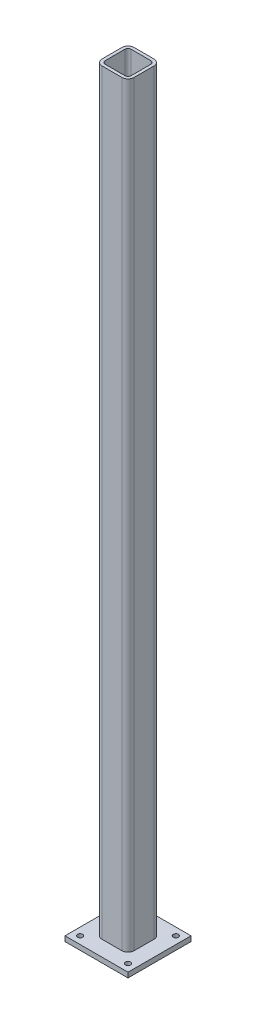
ISO-10303-21;
HEADER;
FILE_DESCRIPTION(('STEP AP214'),'2;1');
FILE_NAME('part.step','',(''),(''),'','','');
FILE_SCHEMA(('AUTOMOTIVE_DESIGN { 1 0 10303 214 1 1 1 1 }'));
ENDSEC;
DATA;
#1=APPLICATION_CONTEXT('core data for automotive mechanical design processes');
#2=APPLICATION_PROTOCOL_DEFINITION('international standard','automotive_design',2000,#1);
#3=PRODUCT_CONTEXT('',#1,'mechanical');
#4=PRODUCT('Part','Part','',(#3));
#5=PRODUCT_RELATED_PRODUCT_CATEGORY('part','',(#4));
#6=PRODUCT_DEFINITION_FORMATION('','',#4);
#7=PRODUCT_DEFINITION_CONTEXT('part definition',#1,'design');
#8=PRODUCT_DEFINITION('design','',#6,#7);
#9=PRODUCT_DEFINITION_SHAPE('','',#8);
#10=(LENGTH_UNIT() NAMED_UNIT(*) SI_UNIT(.MILLI.,.METRE.));
#11=(NAMED_UNIT(*) PLANE_ANGLE_UNIT() SI_UNIT($,.RADIAN.));
#12=(NAMED_UNIT(*) SI_UNIT($,.STERADIAN.) SOLID_ANGLE_UNIT());
#13=UNCERTAINTY_MEASURE_WITH_UNIT(LENGTH_MEASURE(1.E-05),#10,'distance_accuracy_value','');
#14=(GEOMETRIC_REPRESENTATION_CONTEXT(3) GLOBAL_UNCERTAINTY_ASSIGNED_CONTEXT((#13)) GLOBAL_UNIT_ASSIGNED_CONTEXT((#10,
#11,#12)) REPRESENTATION_CONTEXT('',''));
#15=CARTESIAN_POINT('',(0.,0.,0.));
#16=DIRECTION('',(0.,0.,1.));
#17=DIRECTION('',(1.,0.,0.));
#18=AXIS2_PLACEMENT_3D('',#15,#16,#17);
#19=CARTESIAN_POINT('',(0.,-8.,0.));
#20=DIRECTION('',(0.,-1.,0.));
#21=DIRECTION('',(0.,0.,-1.));
#22=AXIS2_PLACEMENT_3D('',#19,#20,#21);
#23=PLANE('',#22);
#24=CARTESIAN_POINT('',(38.,-8.,-38.));
#25=DIRECTION('',(0.,-1.,0.));
#26=DIRECTION('',(0.,0.,-1.));
#27=AXIS2_PLACEMENT_3D('',#24,#25,#26);
#28=CIRCLE('',#27,4.1);
#29=CARTESIAN_POINT('',(38.,-8.,-42.1));
#30=VERTEX_POINT('',#29);
#31=EDGE_CURVE('E165',#30,#30,#28,.T.);
#32=ORIENTED_EDGE('',*,*,#31,.F.);
#33=EDGE_LOOP('',(#32));
#34=FACE_BOUND('',#33,.T.);
#35=CARTESIAN_POINT('',(-38.,-8.,38.));
#36=DIRECTION('',(0.,-1.,0.));
#37=DIRECTION('',(0.,0.,-1.));
#38=AXIS2_PLACEMENT_3D('',#35,#36,#37);
#39=CIRCLE('',#38,4.1);
#40=CARTESIAN_POINT('',(-38.,-8.,33.9));
#41=VERTEX_POINT('',#40);
#42=EDGE_CURVE('E144',#41,#41,#39,.T.);
#43=ORIENTED_EDGE('',*,*,#42,.F.);
#44=EDGE_LOOP('',(#43));
#45=FACE_BOUND('',#44,.T.);
#46=DIRECTION('',(0.,0.,1.));
#47=VECTOR('',#46,1.);
#48=CARTESIAN_POINT('',(50.,-8.,50.));
#49=LINE('',#48,#47);
#50=CARTESIAN_POINT('',(50.,-8.,-50.));
#51=VERTEX_POINT('',#50);
#52=CARTESIAN_POINT('',(50.,-8.,50.));
#53=VERTEX_POINT('',#52);
#54=EDGE_CURVE('E129',#51,#53,#49,.T.);
#55=ORIENTED_EDGE('',*,*,#54,.T.);
#56=DIRECTION('',(-1.,0.,0.));
#57=VECTOR('',#56,1.);
#58=CARTESIAN_POINT('',(-50.,-8.,50.));
#59=LINE('',#58,#57);
#60=CARTESIAN_POINT('',(-50.,-8.,50.));
#61=VERTEX_POINT('',#60);
#62=EDGE_CURVE('E124',#53,#61,#59,.T.);
#63=ORIENTED_EDGE('',*,*,#62,.T.);
#64=DIRECTION('',(0.,0.,-1.));
#65=VECTOR('',#64,1.);
#66=CARTESIAN_POINT('',(-50.,-8.,50.));
#67=LINE('',#66,#65);
#68=CARTESIAN_POINT('',(-50.,-8.,-50.));
#69=VERTEX_POINT('',#68);
#70=EDGE_CURVE('E127',#61,#69,#67,.T.);
#71=ORIENTED_EDGE('',*,*,#70,.T.);
#72=DIRECTION('',(1.,0.,0.));
#73=VECTOR('',#72,1.);
#74=CARTESIAN_POINT('',(-50.,-8.,-50.));
#75=LINE('',#74,#73);
#76=EDGE_CURVE('E94',#69,#51,#75,.T.);
#77=ORIENTED_EDGE('',*,*,#76,.T.);
#78=EDGE_LOOP('',(#55,#63,#71,#77));
#79=FACE_BOUND('',#78,.T.);
#80=CARTESIAN_POINT('',(38.,-8.,38.));
#81=DIRECTION('',(0.,-1.,0.));
#82=DIRECTION('',(0.,0.,-1.));
#83=AXIS2_PLACEMENT_3D('',#80,#81,#82);
#84=CIRCLE('',#83,4.1);
#85=CARTESIAN_POINT('',(38.,-8.,33.9));
#86=VERTEX_POINT('',#85);
#87=EDGE_CURVE('E159',#86,#86,#84,.T.);
#88=ORIENTED_EDGE('',*,*,#87,.F.);
#89=EDGE_LOOP('',(#88));
#90=FACE_BOUND('',#89,.T.);
#91=CARTESIAN_POINT('',(-38.,-8.,-38.));
#92=DIRECTION('',(0.,-1.,0.));
#93=DIRECTION('',(0.,0.,-1.));
#94=AXIS2_PLACEMENT_3D('',#91,#92,#93);
#95=CIRCLE('',#94,4.1);
#96=CARTESIAN_POINT('',(-38.,-8.,-42.1));
#97=VERTEX_POINT('',#96);
#98=EDGE_CURVE('E171',#97,#97,#95,.T.);
#99=ORIENTED_EDGE('',*,*,#98,.F.);
#100=EDGE_LOOP('',(#99));
#101=FACE_BOUND('',#100,.T.);
#102=ADVANCED_FACE('F77',(#34,#45,#79,#90,#101),#23,.T.);
#103=CARTESIAN_POINT('',(0.,0.,0.));
#104=DIRECTION('',(0.,-1.,0.));
#105=DIRECTION('',(0.,0.,-1.));
#106=AXIS2_PLACEMENT_3D('',#103,#104,#105);
#107=PLANE('',#106);
#108=DIRECTION('',(0.,0.,1.));
#109=VECTOR('',#108,1.);
#110=CARTESIAN_POINT('',(50.,0.,50.));
#111=LINE('',#110,#109);
#112=CARTESIAN_POINT('',(50.,0.,-50.));
#113=VERTEX_POINT('',#112);
#114=CARTESIAN_POINT('',(50.,0.,50.));
#115=VERTEX_POINT('',#114);
#116=EDGE_CURVE('E141',#113,#115,#111,.T.);
#117=ORIENTED_EDGE('',*,*,#116,.F.);
#118=DIRECTION('',(1.,0.,0.));
#119=VECTOR('',#118,1.);
#120=CARTESIAN_POINT('',(-50.,0.,-50.));
#121=LINE('',#120,#119);
#122=CARTESIAN_POINT('',(-50.,0.,-50.));
#123=VERTEX_POINT('',#122);
#124=EDGE_CURVE('E117',#123,#113,#121,.T.);
#125=ORIENTED_EDGE('',*,*,#124,.F.);
#126=DIRECTION('',(0.,0.,-1.));
#127=VECTOR('',#126,1.);
#128=CARTESIAN_POINT('',(-50.,0.,50.));
#129=LINE('',#128,#127);
#130=CARTESIAN_POINT('',(-50.,0.,50.));
#131=VERTEX_POINT('',#130);
#132=EDGE_CURVE('E111',#131,#123,#129,.T.);
#133=ORIENTED_EDGE('',*,*,#132,.F.);
#134=DIRECTION('',(-1.,0.,0.));
#135=VECTOR('',#134,1.);
#136=CARTESIAN_POINT('',(-50.,0.,50.));
#137=LINE('',#136,#135);
#138=EDGE_CURVE('E133',#115,#131,#137,.T.);
#139=ORIENTED_EDGE('',*,*,#138,.F.);
#140=EDGE_LOOP('',(#117,#125,#133,#139));
#141=FACE_BOUND('',#140,.T.);
#142=CARTESIAN_POINT('',(-38.,0.,38.));
#143=DIRECTION('',(0.,-1.,0.));
#144=DIRECTION('',(0.,0.,-1.));
#145=AXIS2_PLACEMENT_3D('',#142,#143,#144);
#146=CIRCLE('',#145,4.1);
#147=CARTESIAN_POINT('',(-38.,0.,33.9));
#148=VERTEX_POINT('',#147);
#149=EDGE_CURVE('E156',#148,#148,#146,.T.);
#150=ORIENTED_EDGE('',*,*,#149,.T.);
#151=EDGE_LOOP('',(#150));
#152=FACE_BOUND('',#151,.T.);
#153=CARTESIAN_POINT('',(38.,0.,38.));
#154=DIRECTION('',(0.,-1.,0.));
#155=DIRECTION('',(0.,0.,-1.));
#156=AXIS2_PLACEMENT_3D('',#153,#154,#155);
#157=CIRCLE('',#156,4.1);
#158=CARTESIAN_POINT('',(38.,0.,33.9));
#159=VERTEX_POINT('',#158);
#160=EDGE_CURVE('E162',#159,#159,#157,.T.);
#161=ORIENTED_EDGE('',*,*,#160,.T.);
#162=EDGE_LOOP('',(#161));
#163=FACE_BOUND('',#162,.T.);
#164=CARTESIAN_POINT('',(38.,0.,-38.));
#165=DIRECTION('',(0.,-1.,0.));
#166=DIRECTION('',(0.,0.,-1.));
#167=AXIS2_PLACEMENT_3D('',#164,#165,#166);
#168=CIRCLE('',#167,4.1);
#169=CARTESIAN_POINT('',(38.,0.,-42.1));
#170=VERTEX_POINT('',#169);
#171=EDGE_CURVE('E168',#170,#170,#168,.T.);
#172=ORIENTED_EDGE('',*,*,#171,.T.);
#173=EDGE_LOOP('',(#172));
#174=FACE_BOUND('',#173,.T.);
#175=CARTESIAN_POINT('',(-38.,0.,-38.));
#176=DIRECTION('',(0.,-1.,0.));
#177=DIRECTION('',(0.,0.,-1.));
#178=AXIS2_PLACEMENT_3D('',#175,#176,#177);
#179=CIRCLE('',#178,4.1);
#180=CARTESIAN_POINT('',(-38.,0.,-42.1));
#181=VERTEX_POINT('',#180);
#182=EDGE_CURVE('E174',#181,#181,#179,.T.);
#183=ORIENTED_EDGE('',*,*,#182,.T.);
#184=EDGE_LOOP('',(#183));
#185=FACE_BOUND('',#184,.T.);
#186=ADVANCED_FACE('F152',(#141,#152,#163,#174,#185),#107,.F.);
#187=CARTESIAN_POINT('',(50.,-8.,50.));
#188=DIRECTION('',(-1.,0.,0.));
#189=DIRECTION('',(0.,0.,1.));
#190=AXIS2_PLACEMENT_3D('',#187,#188,#189);
#191=PLANE('',#190);
#192=ORIENTED_EDGE('',*,*,#116,.T.);
#193=DIRECTION('',(0.,1.,0.));
#194=VECTOR('',#193,1.);
#195=CARTESIAN_POINT('',(50.,-8.,50.));
#196=LINE('',#195,#194);
#197=EDGE_CURVE('E13',#53,#115,#196,.T.);
#198=ORIENTED_EDGE('',*,*,#197,.F.);
#199=ORIENTED_EDGE('',*,*,#54,.F.);
#200=DIRECTION('',(0.,1.,0.));
#201=VECTOR('',#200,1.);
#202=CARTESIAN_POINT('',(50.,-8.,-50.));
#203=LINE('',#202,#201);
#204=EDGE_CURVE('E137',#51,#113,#203,.T.);
#205=ORIENTED_EDGE('',*,*,#204,.T.);
#206=EDGE_LOOP('',(#192,#198,#199,#205));
#207=FACE_BOUND('',#206,.T.);
#208=ADVANCED_FACE('F79',(#207),#191,.F.);
#209=CARTESIAN_POINT('',(-50.,-8.,50.));
#210=DIRECTION('',(0.,0.,-1.));
#211=DIRECTION('',(-1.,0.,0.));
#212=AXIS2_PLACEMENT_3D('',#209,#210,#211);
#213=PLANE('',#212);
#214=ORIENTED_EDGE('',*,*,#138,.T.);
#215=DIRECTION('',(0.,1.,0.));
#216=VECTOR('',#215,1.);
#217=CARTESIAN_POINT('',(-50.,-8.,50.));
#218=LINE('',#217,#216);
#219=EDGE_CURVE('E86',#61,#131,#218,.T.);
#220=ORIENTED_EDGE('',*,*,#219,.F.);
#221=ORIENTED_EDGE('',*,*,#62,.F.);
#222=ORIENTED_EDGE('',*,*,#197,.T.);
#223=EDGE_LOOP('',(#214,#220,#221,#222));
#224=FACE_BOUND('',#223,.T.);
#225=ADVANCED_FACE('F132',(#224),#213,.F.);
#226=CARTESIAN_POINT('',(-50.,-8.,50.));
#227=DIRECTION('',(1.,0.,0.));
#228=DIRECTION('',(0.,0.,-1.));
#229=AXIS2_PLACEMENT_3D('',#226,#227,#228);
#230=PLANE('',#229);
#231=ORIENTED_EDGE('',*,*,#132,.T.);
#232=DIRECTION('',(0.,1.,0.));
#233=VECTOR('',#232,1.);
#234=CARTESIAN_POINT('',(-50.,-8.,-50.));
#235=LINE('',#234,#233);
#236=EDGE_CURVE('E134',#69,#123,#235,.T.);
#237=ORIENTED_EDGE('',*,*,#236,.F.);
#238=ORIENTED_EDGE('',*,*,#70,.F.);
#239=ORIENTED_EDGE('',*,*,#219,.T.);
#240=EDGE_LOOP('',(#231,#237,#238,#239));
#241=FACE_BOUND('',#240,.T.);
#242=ADVANCED_FACE('F135',(#241),#230,.F.);
#243=CARTESIAN_POINT('',(-50.,-8.,-50.));
#244=DIRECTION('',(0.,0.,1.));
#245=DIRECTION('',(1.,0.,0.));
#246=AXIS2_PLACEMENT_3D('',#243,#244,#245);
#247=PLANE('',#246);
#248=ORIENTED_EDGE('',*,*,#124,.T.);
#249=ORIENTED_EDGE('',*,*,#204,.F.);
#250=ORIENTED_EDGE('',*,*,#76,.F.);
#251=ORIENTED_EDGE('',*,*,#236,.T.);
#252=EDGE_LOOP('',(#248,#249,#250,#251));
#253=FACE_BOUND('',#252,.T.);
#254=ADVANCED_FACE('F149',(#253),#247,.F.);
#255=CARTESIAN_POINT('',(-38.,-8.,38.));
#256=DIRECTION('',(0.,1.,0.));
#257=DIRECTION('',(0.,0.,1.));
#258=AXIS2_PLACEMENT_3D('',#255,#256,#257);
#259=CYLINDRICAL_SURFACE('',#258,4.1);
#260=ORIENTED_EDGE('',*,*,#42,.T.);
#261=EDGE_LOOP('',(#260));
#262=FACE_BOUND('',#261,.T.);
#263=ORIENTED_EDGE('',*,*,#149,.F.);
#264=EDGE_LOOP('',(#263));
#265=FACE_BOUND('',#264,.T.);
#266=ADVANCED_FACE('F193',(#262,#265),#259,.F.);
#267=CARTESIAN_POINT('',(38.,-8.,38.));
#268=DIRECTION('',(0.,1.,0.));
#269=DIRECTION('',(0.,0.,1.));
#270=AXIS2_PLACEMENT_3D('',#267,#268,#269);
#271=CYLINDRICAL_SURFACE('',#270,4.1);
#272=ORIENTED_EDGE('',*,*,#87,.T.);
#273=EDGE_LOOP('',(#272));
#274=FACE_BOUND('',#273,.T.);
#275=ORIENTED_EDGE('',*,*,#160,.F.);
#276=EDGE_LOOP('',(#275));
#277=FACE_BOUND('',#276,.T.);
#278=ADVANCED_FACE('F239',(#274,#277),#271,.F.);
#279=CARTESIAN_POINT('',(38.,-8.,-38.));
#280=DIRECTION('',(0.,1.,0.));
#281=DIRECTION('',(0.,0.,1.));
#282=AXIS2_PLACEMENT_3D('',#279,#280,#281);
#283=CYLINDRICAL_SURFACE('',#282,4.1);
#284=ORIENTED_EDGE('',*,*,#31,.T.);
#285=EDGE_LOOP('',(#284));
#286=FACE_BOUND('',#285,.T.);
#287=ORIENTED_EDGE('',*,*,#171,.F.);
#288=EDGE_LOOP('',(#287));
#289=FACE_BOUND('',#288,.T.);
#290=ADVANCED_FACE('F247',(#286,#289),#283,.F.);
#291=CARTESIAN_POINT('',(-38.,-8.,-38.));
#292=DIRECTION('',(0.,1.,0.));
#293=DIRECTION('',(0.,0.,1.));
#294=AXIS2_PLACEMENT_3D('',#291,#292,#293);
#295=CYLINDRICAL_SURFACE('',#294,4.1);
#296=ORIENTED_EDGE('',*,*,#98,.T.);
#297=EDGE_LOOP('',(#296));
#298=FACE_BOUND('',#297,.T.);
#299=ORIENTED_EDGE('',*,*,#182,.F.);
#300=EDGE_LOOP('',(#299));
#301=FACE_BOUND('',#300,.T.);
#302=ADVANCED_FACE('F180',(#298,#301),#295,.F.);
#303=CLOSED_SHELL('',(#102,#186,#208,#225,#242,#254,#266,#278,#290,#302));
#304=MANIFOLD_SOLID_BREP('B2',#303);
#305=CARTESIAN_POINT('',(15.875,1200.,-15.875));
#306=DIRECTION('',(0.,-1.,0.));
#307=DIRECTION('',(0.,0.,-1.));
#308=AXIS2_PLACEMENT_3D('',#305,#306,#307);
#309=CYLINDRICAL_SURFACE('',#308,9.525);
#310=CARTESIAN_POINT('',(15.875,0.,-15.875));
#311=DIRECTION('',(0.,1.,0.));
#312=DIRECTION('',(0.,0.,1.));
#313=AXIS2_PLACEMENT_3D('',#310,#311,#312);
#314=CIRCLE('',#313,9.525);
#315=CARTESIAN_POINT('',(25.4,0.,-15.875));
#316=VERTEX_POINT('',#315);
#317=CARTESIAN_POINT('',(15.875,0.,-25.4));
#318=VERTEX_POINT('',#317);
#319=EDGE_CURVE('E470',#316,#318,#314,.T.);
#320=ORIENTED_EDGE('',*,*,#319,.T.);
#321=DIRECTION('',(0.,-1.,0.));
#322=VECTOR('',#321,1.);
#323=CARTESIAN_POINT('',(15.875,1200.,-25.4));
#324=LINE('',#323,#322);
#325=CARTESIAN_POINT('',(15.875,1200.,-25.4));
#326=VERTEX_POINT('',#325);
#327=EDGE_CURVE('E75',#326,#318,#324,.T.);
#328=ORIENTED_EDGE('',*,*,#327,.F.);
#329=CARTESIAN_POINT('',(15.875,1200.,-15.875));
#330=DIRECTION('',(0.,1.,0.));
#331=DIRECTION('',(0.,0.,1.));
#332=AXIS2_PLACEMENT_3D('',#329,#330,#331);
#333=CIRCLE('',#332,9.525);
#334=CARTESIAN_POINT('',(25.4,1200.,-15.875));
#335=VERTEX_POINT('',#334);
#336=EDGE_CURVE('E576',#335,#326,#333,.T.);
#337=ORIENTED_EDGE('',*,*,#336,.F.);
#338=DIRECTION('',(0.,-1.,0.));
#339=VECTOR('',#338,1.);
#340=CARTESIAN_POINT('',(25.4,1200.,-15.875));
#341=LINE('',#340,#339);
#342=EDGE_CURVE('E493',#335,#316,#341,.T.);
#343=ORIENTED_EDGE('',*,*,#342,.T.);
#344=EDGE_LOOP('',(#320,#328,#337,#343));
#345=FACE_BOUND('',#344,.T.);
#346=ADVANCED_FACE('F285',(#345),#309,.T.);
#347=CARTESIAN_POINT('',(15.875,1200.,-25.4));
#348=DIRECTION('',(0.,0.,1.));
#349=DIRECTION('',(1.,0.,0.));
#350=AXIS2_PLACEMENT_3D('',#347,#348,#349);
#351=PLANE('',#350);
#352=DIRECTION('',(-1.,0.,0.));
#353=VECTOR('',#352,1.);
#354=CARTESIAN_POINT('',(15.875,0.,-25.4));
#355=LINE('',#354,#353);
#356=CARTESIAN_POINT('',(-15.875,0.,-25.4));
#357=VERTEX_POINT('',#356);
#358=EDGE_CURVE('E474',#318,#357,#355,.T.);
#359=ORIENTED_EDGE('',*,*,#358,.T.);
#360=DIRECTION('',(0.,-1.,0.));
#361=VECTOR('',#360,1.);
#362=CARTESIAN_POINT('',(-15.875,1200.,-25.4));
#363=LINE('',#362,#361);
#364=CARTESIAN_POINT('',(-15.875,1200.,-25.4));
#365=VERTEX_POINT('',#364);
#366=EDGE_CURVE('E296',#365,#357,#363,.T.);
#367=ORIENTED_EDGE('',*,*,#366,.F.);
#368=DIRECTION('',(-1.,0.,0.));
#369=VECTOR('',#368,1.);
#370=CARTESIAN_POINT('',(15.875,1200.,-25.4));
#371=LINE('',#370,#369);
#372=EDGE_CURVE('E579',#326,#365,#371,.T.);
#373=ORIENTED_EDGE('',*,*,#372,.F.);
#374=ORIENTED_EDGE('',*,*,#327,.T.);
#375=EDGE_LOOP('',(#359,#367,#373,#374));
#376=FACE_BOUND('',#375,.T.);
#377=ADVANCED_FACE('F618',(#376),#351,.F.);
#378=CARTESIAN_POINT('',(-15.875,1200.,-15.875));
#379=DIRECTION('',(0.,-1.,0.));
#380=DIRECTION('',(0.,0.,-1.));
#381=AXIS2_PLACEMENT_3D('',#378,#379,#380);
#382=CYLINDRICAL_SURFACE('',#381,9.525);
#383=CARTESIAN_POINT('',(-15.875,0.,-15.875));
#384=DIRECTION('',(0.,1.,0.));
#385=DIRECTION('',(0.,0.,1.));
#386=AXIS2_PLACEMENT_3D('',#383,#384,#385);
#387=CIRCLE('',#386,9.525);
#388=CARTESIAN_POINT('',(-25.4,0.,-15.875));
#389=VERTEX_POINT('',#388);
#390=EDGE_CURVE('E477',#357,#389,#387,.T.);
#391=ORIENTED_EDGE('',*,*,#390,.T.);
#392=DIRECTION('',(0.,-1.,0.));
#393=VECTOR('',#392,1.);
#394=CARTESIAN_POINT('',(-25.4,1200.,-15.875));
#395=LINE('',#394,#393);
#396=CARTESIAN_POINT('',(-25.4,1200.,-15.875));
#397=VERTEX_POINT('',#396);
#398=EDGE_CURVE('E504',#397,#389,#395,.T.);
#399=ORIENTED_EDGE('',*,*,#398,.F.);
#400=CARTESIAN_POINT('',(-15.875,1200.,-15.875));
#401=DIRECTION('',(0.,1.,0.));
#402=DIRECTION('',(0.,0.,1.));
#403=AXIS2_PLACEMENT_3D('',#400,#401,#402);
#404=CIRCLE('',#403,9.525);
#405=EDGE_CURVE('E582',#365,#397,#404,.T.);
#406=ORIENTED_EDGE('',*,*,#405,.F.);
#407=ORIENTED_EDGE('',*,*,#366,.T.);
#408=EDGE_LOOP('',(#391,#399,#406,#407));
#409=FACE_BOUND('',#408,.T.);
#410=ADVANCED_FACE('F623',(#409),#382,.T.);
#411=CARTESIAN_POINT('',(-25.4,1200.,15.875));
#412=DIRECTION('',(1.,0.,0.));
#413=DIRECTION('',(0.,0.,-1.));
#414=AXIS2_PLACEMENT_3D('',#411,#412,#413);
#415=PLANE('',#414);
#416=DIRECTION('',(0.,0.,1.));
#417=VECTOR('',#416,1.);
#418=CARTESIAN_POINT('',(-25.4,0.,15.875));
#419=LINE('',#418,#417);
#420=CARTESIAN_POINT('',(-25.4,0.,15.875));
#421=VERTEX_POINT('',#420);
#422=EDGE_CURVE('E480',#389,#421,#419,.T.);
#423=ORIENTED_EDGE('',*,*,#422,.T.);
#424=DIRECTION('',(0.,-1.,0.));
#425=VECTOR('',#424,1.);
#426=CARTESIAN_POINT('',(-25.4,1200.,15.875));
#427=LINE('',#426,#425);
#428=CARTESIAN_POINT('',(-25.4,1200.,15.875));
#429=VERTEX_POINT('',#428);
#430=EDGE_CURVE('E500',#429,#421,#427,.T.);
#431=ORIENTED_EDGE('',*,*,#430,.F.);
#432=DIRECTION('',(0.,0.,1.));
#433=VECTOR('',#432,1.);
#434=CARTESIAN_POINT('',(-25.4,1200.,15.875));
#435=LINE('',#434,#433);
#436=EDGE_CURVE('E585',#397,#429,#435,.T.);
#437=ORIENTED_EDGE('',*,*,#436,.F.);
#438=ORIENTED_EDGE('',*,*,#398,.T.);
#439=EDGE_LOOP('',(#423,#431,#437,#438));
#440=FACE_BOUND('',#439,.T.);
#441=ADVANCED_FACE('F593',(#440),#415,.F.);
#442=CARTESIAN_POINT('',(-15.875,1200.,15.875));
#443=DIRECTION('',(0.,-1.,0.));
#444=DIRECTION('',(0.,0.,-1.));
#445=AXIS2_PLACEMENT_3D('',#442,#443,#444);
#446=CYLINDRICAL_SURFACE('',#445,9.52499999999999);
#447=CARTESIAN_POINT('',(-15.875,0.,15.875));
#448=DIRECTION('',(0.,1.,0.));
#449=DIRECTION('',(0.,0.,1.));
#450=AXIS2_PLACEMENT_3D('',#447,#448,#449);
#451=CIRCLE('',#450,9.52499999999999);
#452=CARTESIAN_POINT('',(-15.875,0.,25.4));
#453=VERTEX_POINT('',#452);
#454=EDGE_CURVE('E483',#421,#453,#451,.T.);
#455=ORIENTED_EDGE('',*,*,#454,.T.);
#456=DIRECTION('',(0.,-1.,0.));
#457=VECTOR('',#456,1.);
#458=CARTESIAN_POINT('',(-15.875,1200.,25.4));
#459=LINE('',#458,#457);
#460=CARTESIAN_POINT('',(-15.875,1200.,25.4));
#461=VERTEX_POINT('',#460);
#462=EDGE_CURVE('E427',#461,#453,#459,.T.);
#463=ORIENTED_EDGE('',*,*,#462,.F.);
#464=CARTESIAN_POINT('',(-15.875,1200.,15.875));
#465=DIRECTION('',(0.,1.,0.));
#466=DIRECTION('',(0.,0.,1.));
#467=AXIS2_PLACEMENT_3D('',#464,#465,#466);
#468=CIRCLE('',#467,9.52499999999999);
#469=EDGE_CURVE('E416',#429,#461,#468,.T.);
#470=ORIENTED_EDGE('',*,*,#469,.F.);
#471=ORIENTED_EDGE('',*,*,#430,.T.);
#472=EDGE_LOOP('',(#455,#463,#470,#471));
#473=FACE_BOUND('',#472,.T.);
#474=ADVANCED_FACE('F597',(#473),#446,.T.);
#475=CARTESIAN_POINT('',(-15.875,1200.,25.4));
#476=DIRECTION('',(0.,0.,-1.));
#477=DIRECTION('',(-1.,0.,0.));
#478=AXIS2_PLACEMENT_3D('',#475,#476,#477);
#479=PLANE('',#478);
#480=DIRECTION('',(1.,0.,0.));
#481=VECTOR('',#480,1.);
#482=CARTESIAN_POINT('',(-15.875,0.,25.4));
#483=LINE('',#482,#481);
#484=CARTESIAN_POINT('',(15.875,0.,25.4));
#485=VERTEX_POINT('',#484);
#486=EDGE_CURVE('E425',#453,#485,#483,.T.);
#487=ORIENTED_EDGE('',*,*,#486,.T.);
#488=DIRECTION('',(0.,-1.,0.));
#489=VECTOR('',#488,1.);
#490=CARTESIAN_POINT('',(15.875,1200.,25.4));
#491=LINE('',#490,#489);
#492=CARTESIAN_POINT('',(15.875,1200.,25.4));
#493=VERTEX_POINT('',#492);
#494=EDGE_CURVE('E422',#493,#485,#491,.T.);
#495=ORIENTED_EDGE('',*,*,#494,.F.);
#496=DIRECTION('',(1.,0.,0.));
#497=VECTOR('',#496,1.);
#498=CARTESIAN_POINT('',(-15.875,1200.,25.4));
#499=LINE('',#498,#497);
#500=EDGE_CURVE('E410',#461,#493,#499,.T.);
#501=ORIENTED_EDGE('',*,*,#500,.F.);
#502=ORIENTED_EDGE('',*,*,#462,.T.);
#503=EDGE_LOOP('',(#487,#495,#501,#502));
#504=FACE_BOUND('',#503,.T.);
#505=ADVANCED_FACE('F423',(#504),#479,.F.);
#506=CARTESIAN_POINT('',(15.875,1200.,15.875));
#507=DIRECTION('',(0.,-1.,0.));
#508=DIRECTION('',(0.,0.,-1.));
#509=AXIS2_PLACEMENT_3D('',#506,#507,#508);
#510=CYLINDRICAL_SURFACE('',#509,9.525);
#511=CARTESIAN_POINT('',(15.875,0.,15.875));
#512=DIRECTION('',(0.,1.,0.));
#513=DIRECTION('',(0.,0.,1.));
#514=AXIS2_PLACEMENT_3D('',#511,#512,#513);
#515=CIRCLE('',#514,9.525);
#516=CARTESIAN_POINT('',(25.4,0.,15.875));
#517=VERTEX_POINT('',#516);
#518=EDGE_CURVE('E358',#485,#517,#515,.T.);
#519=ORIENTED_EDGE('',*,*,#518,.T.);
#520=DIRECTION('',(0.,-1.,0.));
#521=VECTOR('',#520,1.);
#522=CARTESIAN_POINT('',(25.4,1200.,15.875));
#523=LINE('',#522,#521);
#524=CARTESIAN_POINT('',(25.4,1200.,15.875));
#525=VERTEX_POINT('',#524);
#526=EDGE_CURVE('E428',#525,#517,#523,.T.);
#527=ORIENTED_EDGE('',*,*,#526,.F.);
#528=CARTESIAN_POINT('',(15.875,1200.,15.875));
#529=DIRECTION('',(0.,1.,0.));
#530=DIRECTION('',(0.,0.,1.));
#531=AXIS2_PLACEMENT_3D('',#528,#529,#530);
#532=CIRCLE('',#531,9.525);
#533=EDGE_CURVE('E414',#493,#525,#532,.T.);
#534=ORIENTED_EDGE('',*,*,#533,.F.);
#535=ORIENTED_EDGE('',*,*,#494,.T.);
#536=EDGE_LOOP('',(#519,#527,#534,#535));
#537=FACE_BOUND('',#536,.T.);
#538=ADVANCED_FACE('F430',(#537),#510,.T.);
#539=CARTESIAN_POINT('',(-15.875,1200.,-15.875));
#540=DIRECTION('',(0.,-1.,0.));
#541=DIRECTION('',(0.,0.,-1.));
#542=AXIS2_PLACEMENT_3D('',#539,#540,#541);
#543=CYLINDRICAL_SURFACE('',#542,4.7625);
#544=CARTESIAN_POINT('',(-15.875,0.,-15.875));
#545=DIRECTION('',(0.,1.,0.));
#546=DIRECTION('',(0.,0.,1.));
#547=AXIS2_PLACEMENT_3D('',#544,#545,#546);
#548=CIRCLE('',#547,4.7625);
#549=CARTESIAN_POINT('',(-15.875,0.,-20.6375));
#550=VERTEX_POINT('',#549);
#551=CARTESIAN_POINT('',(-20.6375,0.,-15.875));
#552=VERTEX_POINT('',#551);
#553=EDGE_CURVE('E438',#550,#552,#548,.T.);
#554=ORIENTED_EDGE('',*,*,#553,.F.);
#555=DIRECTION('',(0.,-1.,0.));
#556=VECTOR('',#555,1.);
#557=CARTESIAN_POINT('',(-15.875,1200.,-20.6375));
#558=LINE('',#557,#556);
#559=CARTESIAN_POINT('',(-15.875,1200.,-20.6375));
#560=VERTEX_POINT('',#559);
#561=EDGE_CURVE('E289',#560,#550,#558,.T.);
#562=ORIENTED_EDGE('',*,*,#561,.F.);
#563=CARTESIAN_POINT('',(-15.875,1200.,-15.875));
#564=DIRECTION('',(0.,1.,0.));
#565=DIRECTION('',(0.,0.,1.));
#566=AXIS2_PLACEMENT_3D('',#563,#564,#565);
#567=CIRCLE('',#566,4.7625);
#568=CARTESIAN_POINT('',(-20.6375,1200.,-15.875));
#569=VERTEX_POINT('',#568);
#570=EDGE_CURVE('E492',#560,#569,#567,.T.);
#571=ORIENTED_EDGE('',*,*,#570,.T.);
#572=DIRECTION('',(0.,-1.,0.));
#573=VECTOR('',#572,1.);
#574=CARTESIAN_POINT('',(-20.6375,1200.,-15.875));
#575=LINE('',#574,#573);
#576=EDGE_CURVE('E434',#569,#552,#575,.T.);
#577=ORIENTED_EDGE('',*,*,#576,.T.);
#578=EDGE_LOOP('',(#554,#562,#571,#577));
#579=FACE_BOUND('',#578,.T.);
#580=ADVANCED_FACE('F287',(#579),#543,.F.);
#581=CARTESIAN_POINT('',(15.875,1200.,-20.6375));
#582=DIRECTION('',(0.,0.,1.));
#583=DIRECTION('',(1.,0.,0.));
#584=AXIS2_PLACEMENT_3D('',#581,#582,#583);
#585=PLANE('',#584);
#586=DIRECTION('',(-1.,0.,0.));
#587=VECTOR('',#586,1.);
#588=CARTESIAN_POINT('',(15.875,0.,-20.6375));
#589=LINE('',#588,#587);
#590=CARTESIAN_POINT('',(15.875,0.,-20.6375));
#591=VERTEX_POINT('',#590);
#592=EDGE_CURVE('E442',#591,#550,#589,.T.);
#593=ORIENTED_EDGE('',*,*,#592,.F.);
#594=DIRECTION('',(0.,-1.,0.));
#595=VECTOR('',#594,1.);
#596=CARTESIAN_POINT('',(15.875,1200.,-20.6375));
#597=LINE('',#596,#595);
#598=CARTESIAN_POINT('',(15.875,1200.,-20.6375));
#599=VERTEX_POINT('',#598);
#600=EDGE_CURVE('E527',#599,#591,#597,.T.);
#601=ORIENTED_EDGE('',*,*,#600,.F.);
#602=DIRECTION('',(-1.,0.,0.));
#603=VECTOR('',#602,1.);
#604=CARTESIAN_POINT('',(15.875,1200.,-20.6375));
#605=LINE('',#604,#603);
#606=EDGE_CURVE('E538',#599,#560,#605,.T.);
#607=ORIENTED_EDGE('',*,*,#606,.T.);
#608=ORIENTED_EDGE('',*,*,#561,.T.);
#609=EDGE_LOOP('',(#593,#601,#607,#608));
#610=FACE_BOUND('',#609,.T.);
#611=ADVANCED_FACE('F536',(#610),#585,.T.);
#612=CARTESIAN_POINT('',(15.875,1200.,-15.875));
#613=DIRECTION('',(0.,-1.,0.));
#614=DIRECTION('',(0.,0.,-1.));
#615=AXIS2_PLACEMENT_3D('',#612,#613,#614);
#616=CYLINDRICAL_SURFACE('',#615,4.7625);
#617=CARTESIAN_POINT('',(15.875,0.,-15.875));
#618=DIRECTION('',(0.,1.,0.));
#619=DIRECTION('',(0.,0.,1.));
#620=AXIS2_PLACEMENT_3D('',#617,#618,#619);
#621=CIRCLE('',#620,4.7625);
#622=CARTESIAN_POINT('',(20.6375,0.,-15.875));
#623=VERTEX_POINT('',#622);
#624=EDGE_CURVE('E446',#623,#591,#621,.T.);
#625=ORIENTED_EDGE('',*,*,#624,.F.);
#626=DIRECTION('',(0.,-1.,0.));
#627=VECTOR('',#626,1.);
#628=CARTESIAN_POINT('',(20.6375,1200.,-15.875));
#629=LINE('',#628,#627);
#630=CARTESIAN_POINT('',(20.6375,1200.,-15.875));
#631=VERTEX_POINT('',#630);
#632=EDGE_CURVE('E525',#631,#623,#629,.T.);
#633=ORIENTED_EDGE('',*,*,#632,.F.);
#634=CARTESIAN_POINT('',(15.875,1200.,-15.875));
#635=DIRECTION('',(0.,1.,0.));
#636=DIRECTION('',(0.,0.,1.));
#637=AXIS2_PLACEMENT_3D('',#634,#635,#636);
#638=CIRCLE('',#637,4.7625);
#639=EDGE_CURVE('E546',#631,#599,#638,.T.);
#640=ORIENTED_EDGE('',*,*,#639,.T.);
#641=ORIENTED_EDGE('',*,*,#600,.T.);
#642=EDGE_LOOP('',(#625,#633,#640,#641));
#643=FACE_BOUND('',#642,.T.);
#644=ADVANCED_FACE('F544',(#643),#616,.F.);
#645=CARTESIAN_POINT('',(20.6375,1200.,-15.875));
#646=DIRECTION('',(-1.,0.,0.));
#647=DIRECTION('',(0.,0.,1.));
#648=AXIS2_PLACEMENT_3D('',#645,#646,#647);
#649=PLANE('',#648);
#650=DIRECTION('',(0.,0.,-1.));
#651=VECTOR('',#650,1.);
#652=CARTESIAN_POINT('',(20.6375,0.,-15.875));
#653=LINE('',#652,#651);
#654=CARTESIAN_POINT('',(20.6375,0.,15.875));
#655=VERTEX_POINT('',#654);
#656=EDGE_CURVE('E450',#655,#623,#653,.T.);
#657=ORIENTED_EDGE('',*,*,#656,.F.);
#658=DIRECTION('',(0.,-1.,0.));
#659=VECTOR('',#658,1.);
#660=CARTESIAN_POINT('',(20.6375,1200.,15.875));
#661=LINE('',#660,#659);
#662=CARTESIAN_POINT('',(20.6375,1200.,15.875));
#663=VERTEX_POINT('',#662);
#664=EDGE_CURVE('E522',#663,#655,#661,.T.);
#665=ORIENTED_EDGE('',*,*,#664,.F.);
#666=DIRECTION('',(0.,0.,-1.));
#667=VECTOR('',#666,1.);
#668=CARTESIAN_POINT('',(20.6375,1200.,-15.875));
#669=LINE('',#668,#667);
#670=EDGE_CURVE('E552',#663,#631,#669,.T.);
#671=ORIENTED_EDGE('',*,*,#670,.T.);
#672=ORIENTED_EDGE('',*,*,#632,.T.);
#673=EDGE_LOOP('',(#657,#665,#671,#672));
#674=FACE_BOUND('',#673,.T.);
#675=ADVANCED_FACE('F556',(#674),#649,.T.);
#676=CARTESIAN_POINT('',(15.875,1200.,15.875));
#677=DIRECTION('',(0.,-1.,0.));
#678=DIRECTION('',(0.,0.,-1.));
#679=AXIS2_PLACEMENT_3D('',#676,#677,#678);
#680=CYLINDRICAL_SURFACE('',#679,4.7625);
#681=CARTESIAN_POINT('',(15.875,0.,15.875));
#682=DIRECTION('',(0.,1.,0.));
#683=DIRECTION('',(0.,0.,1.));
#684=AXIS2_PLACEMENT_3D('',#681,#682,#683);
#685=CIRCLE('',#684,4.7625);
#686=CARTESIAN_POINT('',(15.875,0.,20.6375));
#687=VERTEX_POINT('',#686);
#688=EDGE_CURVE('E454',#687,#655,#685,.T.);
#689=ORIENTED_EDGE('',*,*,#688,.F.);
#690=DIRECTION('',(0.,-1.,0.));
#691=VECTOR('',#690,1.);
#692=CARTESIAN_POINT('',(15.875,1200.,20.6375));
#693=LINE('',#692,#691);
#694=CARTESIAN_POINT('',(15.875,1200.,20.6375));
#695=VERTEX_POINT('',#694);
#696=EDGE_CURVE('E519',#695,#687,#693,.T.);
#697=ORIENTED_EDGE('',*,*,#696,.F.);
#698=CARTESIAN_POINT('',(15.875,1200.,15.875));
#699=DIRECTION('',(0.,1.,0.));
#700=DIRECTION('',(0.,0.,1.));
#701=AXIS2_PLACEMENT_3D('',#698,#699,#700);
#702=CIRCLE('',#701,4.7625);
#703=EDGE_CURVE('E558',#695,#663,#702,.T.);
#704=ORIENTED_EDGE('',*,*,#703,.T.);
#705=ORIENTED_EDGE('',*,*,#664,.T.);
#706=EDGE_LOOP('',(#689,#697,#704,#705));
#707=FACE_BOUND('',#706,.T.);
#708=ADVANCED_FACE('F634',(#707),#680,.F.);
#709=CARTESIAN_POINT('',(-15.875,1200.,20.6375));
#710=DIRECTION('',(0.,0.,-1.));
#711=DIRECTION('',(-1.,0.,0.));
#712=AXIS2_PLACEMENT_3D('',#709,#710,#711);
#713=PLANE('',#712);
#714=DIRECTION('',(1.,0.,0.));
#715=VECTOR('',#714,1.);
#716=CARTESIAN_POINT('',(-15.875,0.,20.6375));
#717=LINE('',#716,#715);
#718=CARTESIAN_POINT('',(-15.875,0.,20.6375));
#719=VERTEX_POINT('',#718);
#720=EDGE_CURVE('E458',#719,#687,#717,.T.);
#721=ORIENTED_EDGE('',*,*,#720,.F.);
#722=DIRECTION('',(0.,-1.,0.));
#723=VECTOR('',#722,1.);
#724=CARTESIAN_POINT('',(-15.875,1200.,20.6375));
#725=LINE('',#724,#723);
#726=CARTESIAN_POINT('',(-15.875,1200.,20.6375));
#727=VERTEX_POINT('',#726);
#728=EDGE_CURVE('E516',#727,#719,#725,.T.);
#729=ORIENTED_EDGE('',*,*,#728,.F.);
#730=DIRECTION('',(1.,0.,0.));
#731=VECTOR('',#730,1.);
#732=CARTESIAN_POINT('',(-15.875,1200.,20.6375));
#733=LINE('',#732,#731);
#734=EDGE_CURVE('E561',#727,#695,#733,.T.);
#735=ORIENTED_EDGE('',*,*,#734,.T.);
#736=ORIENTED_EDGE('',*,*,#696,.T.);
#737=EDGE_LOOP('',(#721,#729,#735,#736));
#738=FACE_BOUND('',#737,.T.);
#739=ADVANCED_FACE('F630',(#738),#713,.T.);
#740=CARTESIAN_POINT('',(-15.875,1200.,15.875));
#741=DIRECTION('',(0.,-1.,0.));
#742=DIRECTION('',(0.,0.,-1.));
#743=AXIS2_PLACEMENT_3D('',#740,#741,#742);
#744=CYLINDRICAL_SURFACE('',#743,4.76249999999999);
#745=CARTESIAN_POINT('',(-15.875,0.,15.875));
#746=DIRECTION('',(0.,1.,0.));
#747=DIRECTION('',(0.,0.,1.));
#748=AXIS2_PLACEMENT_3D('',#745,#746,#747);
#749=CIRCLE('',#748,4.76249999999999);
#750=CARTESIAN_POINT('',(-20.6375,0.,15.875));
#751=VERTEX_POINT('',#750);
#752=EDGE_CURVE('E462',#751,#719,#749,.T.);
#753=ORIENTED_EDGE('',*,*,#752,.F.);
#754=DIRECTION('',(0.,-1.,0.));
#755=VECTOR('',#754,1.);
#756=CARTESIAN_POINT('',(-20.6375,1200.,15.875));
#757=LINE('',#756,#755);
#758=CARTESIAN_POINT('',(-20.6375,1200.,15.875));
#759=VERTEX_POINT('',#758);
#760=EDGE_CURVE('E513',#759,#751,#757,.T.);
#761=ORIENTED_EDGE('',*,*,#760,.F.);
#762=CARTESIAN_POINT('',(-15.875,1200.,15.875));
#763=DIRECTION('',(0.,1.,0.));
#764=DIRECTION('',(0.,0.,1.));
#765=AXIS2_PLACEMENT_3D('',#762,#763,#764);
#766=CIRCLE('',#765,4.76249999999999);
#767=EDGE_CURVE('E568',#759,#727,#766,.T.);
#768=ORIENTED_EDGE('',*,*,#767,.T.);
#769=ORIENTED_EDGE('',*,*,#728,.T.);
#770=EDGE_LOOP('',(#753,#761,#768,#769));
#771=FACE_BOUND('',#770,.T.);
#772=ADVANCED_FACE('F612',(#771),#744,.F.);
#773=CARTESIAN_POINT('',(-20.6375,1200.,15.875));
#774=DIRECTION('',(1.,0.,0.));
#775=DIRECTION('',(0.,0.,-1.));
#776=AXIS2_PLACEMENT_3D('',#773,#774,#775);
#777=PLANE('',#776);
#778=DIRECTION('',(0.,0.,1.));
#779=VECTOR('',#778,1.);
#780=CARTESIAN_POINT('',(-20.6375,0.,15.875));
#781=LINE('',#780,#779);
#782=EDGE_CURVE('E466',#552,#751,#781,.T.);
#783=ORIENTED_EDGE('',*,*,#782,.F.);
#784=ORIENTED_EDGE('',*,*,#576,.F.);
#785=DIRECTION('',(0.,0.,1.));
#786=VECTOR('',#785,1.);
#787=CARTESIAN_POINT('',(-20.6375,1200.,15.875));
#788=LINE('',#787,#786);
#789=EDGE_CURVE('E572',#569,#759,#788,.T.);
#790=ORIENTED_EDGE('',*,*,#789,.T.);
#791=ORIENTED_EDGE('',*,*,#760,.T.);
#792=EDGE_LOOP('',(#783,#784,#790,#791));
#793=FACE_BOUND('',#792,.T.);
#794=ADVANCED_FACE('F605',(#793),#777,.T.);
#795=CARTESIAN_POINT('',(25.4,1200.,-15.875));
#796=DIRECTION('',(-1.,0.,0.));
#797=DIRECTION('',(0.,0.,1.));
#798=AXIS2_PLACEMENT_3D('',#795,#796,#797);
#799=PLANE('',#798);
#800=DIRECTION('',(0.,0.,-1.));
#801=VECTOR('',#800,1.);
#802=CARTESIAN_POINT('',(25.4,0.,-15.875));
#803=LINE('',#802,#801);
#804=EDGE_CURVE('E364',#517,#316,#803,.T.);
#805=ORIENTED_EDGE('',*,*,#804,.T.);
#806=ORIENTED_EDGE('',*,*,#342,.F.);
#807=DIRECTION('',(0.,0.,-1.));
#808=VECTOR('',#807,1.);
#809=CARTESIAN_POINT('',(25.4,1200.,-15.875));
#810=LINE('',#809,#808);
#811=EDGE_CURVE('E305',#525,#335,#810,.T.);
#812=ORIENTED_EDGE('',*,*,#811,.F.);
#813=ORIENTED_EDGE('',*,*,#526,.T.);
#814=EDGE_LOOP('',(#805,#806,#812,#813));
#815=FACE_BOUND('',#814,.T.);
#816=ADVANCED_FACE('F603',(#815),#799,.F.);
#817=CARTESIAN_POINT('',(15.875,1200.,-15.875));
#818=DIRECTION('',(0.,1.,0.));
#819=DIRECTION('',(0.,0.,1.));
#820=AXIS2_PLACEMENT_3D('',#817,#818,#819);
#821=PLANE('',#820);
#822=ORIENTED_EDGE('',*,*,#570,.F.);
#823=ORIENTED_EDGE('',*,*,#606,.F.);
#824=ORIENTED_EDGE('',*,*,#639,.F.);
#825=ORIENTED_EDGE('',*,*,#670,.F.);
#826=ORIENTED_EDGE('',*,*,#703,.F.);
#827=ORIENTED_EDGE('',*,*,#734,.F.);
#828=ORIENTED_EDGE('',*,*,#767,.F.);
#829=ORIENTED_EDGE('',*,*,#789,.F.);
#830=EDGE_LOOP('',(#822,#823,#824,#825,#826,#827,#828,#829));
#831=FACE_BOUND('',#830,.T.);
#832=ORIENTED_EDGE('',*,*,#336,.T.);
#833=ORIENTED_EDGE('',*,*,#372,.T.);
#834=ORIENTED_EDGE('',*,*,#405,.T.);
#835=ORIENTED_EDGE('',*,*,#436,.T.);
#836=ORIENTED_EDGE('',*,*,#469,.T.);
#837=ORIENTED_EDGE('',*,*,#500,.T.);
#838=ORIENTED_EDGE('',*,*,#533,.T.);
#839=ORIENTED_EDGE('',*,*,#811,.T.);
#840=EDGE_LOOP('',(#832,#833,#834,#835,#836,#837,#838,#839));
#841=FACE_BOUND('',#840,.T.);
#842=ADVANCED_FACE('F412',(#831,#841),#821,.T.);
#843=CARTESIAN_POINT('',(15.875,0.,-15.875));
#844=DIRECTION('',(0.,1.,0.));
#845=DIRECTION('',(0.,0.,1.));
#846=AXIS2_PLACEMENT_3D('',#843,#844,#845);
#847=PLANE('',#846);
#848=ORIENTED_EDGE('',*,*,#553,.T.);
#849=ORIENTED_EDGE('',*,*,#782,.T.);
#850=ORIENTED_EDGE('',*,*,#752,.T.);
#851=ORIENTED_EDGE('',*,*,#720,.T.);
#852=ORIENTED_EDGE('',*,*,#688,.T.);
#853=ORIENTED_EDGE('',*,*,#656,.T.);
#854=ORIENTED_EDGE('',*,*,#624,.T.);
#855=ORIENTED_EDGE('',*,*,#592,.T.);
#856=EDGE_LOOP('',(#848,#849,#850,#851,#852,#853,#854,#855));
#857=FACE_BOUND('',#856,.T.);
#858=ORIENTED_EDGE('',*,*,#319,.F.);
#859=ORIENTED_EDGE('',*,*,#804,.F.);
#860=ORIENTED_EDGE('',*,*,#518,.F.);
#861=ORIENTED_EDGE('',*,*,#486,.F.);
#862=ORIENTED_EDGE('',*,*,#454,.F.);
#863=ORIENTED_EDGE('',*,*,#422,.F.);
#864=ORIENTED_EDGE('',*,*,#390,.F.);
#865=ORIENTED_EDGE('',*,*,#358,.F.);
#866=EDGE_LOOP('',(#858,#859,#860,#861,#862,#863,#864,#865));
#867=FACE_BOUND('',#866,.T.);
#868=ADVANCED_FACE('F541',(#857,#867),#847,.F.);
#869=CLOSED_SHELL('',(#346,#377,#410,#441,#474,#505,#538,#580,#611,#644,#675,#708,#739,#772,
#794,#816,#842,#868));
#870=MANIFOLD_SOLID_BREP('B7',#869);
#871=ADVANCED_BREP_SHAPE_REPRESENTATION('',(#18,#304,#870),#14);
#872=SHAPE_DEFINITION_REPRESENTATION(#9,#871);
ENDSEC;
END-ISO-10303-21;
